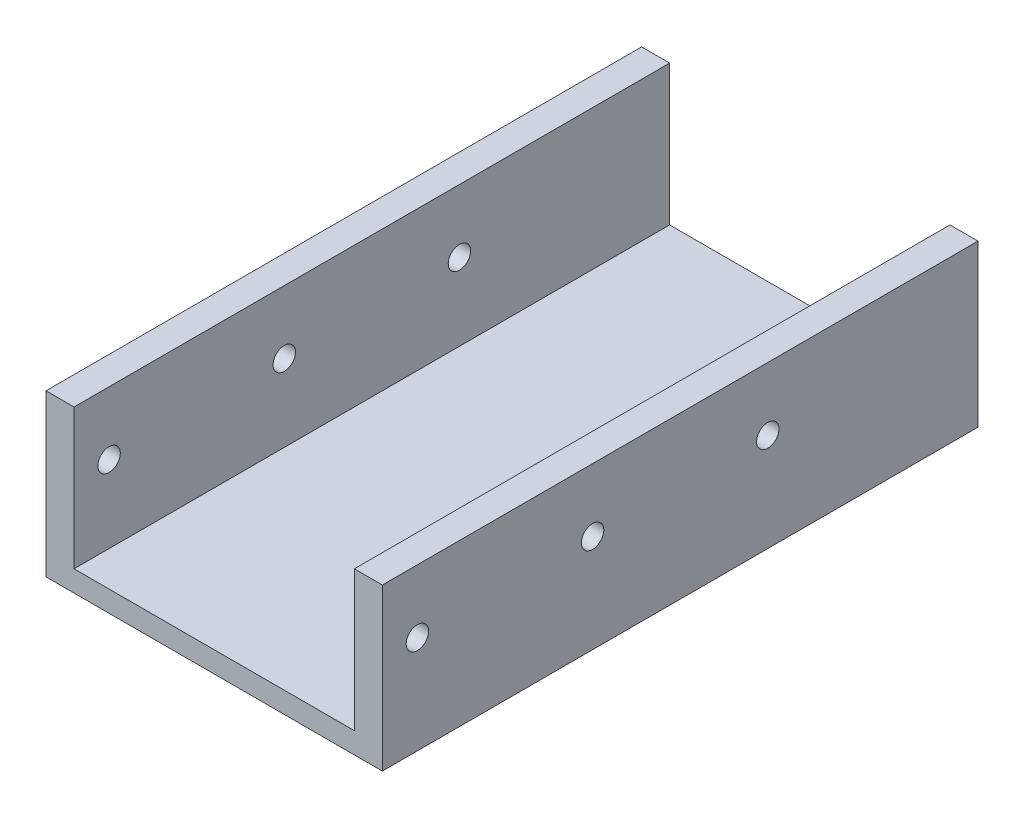
ISO-10303-21;
HEADER;
FILE_DESCRIPTION(('STEP AP214'),'2;1');
FILE_NAME('part.step','',(''),(''),'','','');
FILE_SCHEMA(('AUTOMOTIVE_DESIGN { 1 0 10303 214 1 1 1 1 }'));
ENDSEC;
DATA;
#1=APPLICATION_CONTEXT('core data for automotive mechanical design processes');
#2=APPLICATION_PROTOCOL_DEFINITION('international standard','automotive_design',2000,#1);
#3=PRODUCT_CONTEXT('',#1,'mechanical');
#4=PRODUCT('Part','Part','',(#3));
#5=PRODUCT_RELATED_PRODUCT_CATEGORY('part','',(#4));
#6=PRODUCT_DEFINITION_FORMATION('','',#4);
#7=PRODUCT_DEFINITION_CONTEXT('part definition',#1,'design');
#8=PRODUCT_DEFINITION('design','',#6,#7);
#9=PRODUCT_DEFINITION_SHAPE('','',#8);
#10=(LENGTH_UNIT() NAMED_UNIT(*) SI_UNIT(.MILLI.,.METRE.));
#11=(NAMED_UNIT(*) PLANE_ANGLE_UNIT() SI_UNIT($,.RADIAN.));
#12=(NAMED_UNIT(*) SI_UNIT($,.STERADIAN.) SOLID_ANGLE_UNIT());
#13=UNCERTAINTY_MEASURE_WITH_UNIT(LENGTH_MEASURE(1.E-05),#10,'distance_accuracy_value','');
#14=(GEOMETRIC_REPRESENTATION_CONTEXT(3) GLOBAL_UNCERTAINTY_ASSIGNED_CONTEXT((#13)) GLOBAL_UNIT_ASSIGNED_CONTEXT((#10,
#11,#12)) REPRESENTATION_CONTEXT('',''));
#15=CARTESIAN_POINT('',(0.,0.,0.));
#16=DIRECTION('',(0.,0.,1.));
#17=DIRECTION('',(1.,0.,0.));
#18=AXIS2_PLACEMENT_3D('',#15,#16,#17);
#19=CARTESIAN_POINT('',(0.,3.,0.));
#20=DIRECTION('',(0.,-1.,0.));
#21=DIRECTION('',(0.,0.,-1.));
#22=AXIS2_PLACEMENT_3D('',#19,#20,#21);
#23=PLANE('',#22);
#24=DIRECTION('',(0.,0.,-1.));
#25=VECTOR('',#24,1.);
#26=CARTESIAN_POINT('',(-20.,3.,-55.));
#27=LINE('',#26,#25);
#28=CARTESIAN_POINT('',(-20.,3.,30.));
#29=VERTEX_POINT('',#28);
#30=CARTESIAN_POINT('',(-20.,3.,-55.));
#31=VERTEX_POINT('',#30);
#32=EDGE_CURVE('E167',#29,#31,#27,.T.);
#33=ORIENTED_EDGE('',*,*,#32,.F.);
#34=DIRECTION('',(1.,0.,0.));
#35=VECTOR('',#34,1.);
#36=CARTESIAN_POINT('',(0.,3.,30.));
#37=LINE('',#36,#35);
#38=CARTESIAN_POINT('',(20.,3.,30.));
#39=VERTEX_POINT('',#38);
#40=EDGE_CURVE('E192',#29,#39,#37,.T.);
#41=ORIENTED_EDGE('',*,*,#40,.T.);
#42=DIRECTION('',(0.,0.,1.));
#43=VECTOR('',#42,1.);
#44=CARTESIAN_POINT('',(20.,3.,-55.));
#45=LINE('',#44,#43);
#46=CARTESIAN_POINT('',(20.,3.,-55.));
#47=VERTEX_POINT('',#46);
#48=EDGE_CURVE('E60',#47,#39,#45,.T.);
#49=ORIENTED_EDGE('',*,*,#48,.F.);
#50=DIRECTION('',(-1.,0.,0.));
#51=VECTOR('',#50,1.);
#52=CARTESIAN_POINT('',(-24.,3.,-55.));
#53=LINE('',#52,#51);
#54=EDGE_CURVE('E124',#47,#31,#53,.T.);
#55=ORIENTED_EDGE('',*,*,#54,.T.);
#56=EDGE_LOOP('',(#33,#41,#49,#55));
#57=FACE_BOUND('',#56,.T.);
#58=ADVANCED_FACE('F38',(#57),#23,.F.);
#59=CARTESIAN_POINT('',(24.,3.,55.));
#60=DIRECTION('',(-1.,0.,0.));
#61=DIRECTION('',(0.,0.,1.));
#62=AXIS2_PLACEMENT_3D('',#59,#60,#61);
#63=PLANE('',#62);
#64=CARTESIAN_POINT('',(24.,14.,25.));
#65=DIRECTION('',(-1.,0.,0.));
#66=DIRECTION('',(0.,0.,-1.));
#67=AXIS2_PLACEMENT_3D('',#64,#65,#66);
#68=CIRCLE('',#67,1.59999999999999);
#69=CARTESIAN_POINT('',(24.,14.,23.4));
#70=VERTEX_POINT('',#69);
#71=EDGE_CURVE('E208',#70,#70,#68,.T.);
#72=ORIENTED_EDGE('',*,*,#71,.T.);
#73=EDGE_LOOP('',(#72));
#74=FACE_BOUND('',#73,.T.);
#75=CARTESIAN_POINT('',(24.,14.,-25.));
#76=DIRECTION('',(-1.,0.,0.));
#77=DIRECTION('',(0.,0.,1.));
#78=AXIS2_PLACEMENT_3D('',#75,#76,#77);
#79=CIRCLE('',#78,1.6);
#80=CARTESIAN_POINT('',(24.,14.,-23.4));
#81=VERTEX_POINT('',#80);
#82=EDGE_CURVE('E201',#81,#81,#79,.T.);
#83=ORIENTED_EDGE('',*,*,#82,.T.);
#84=EDGE_LOOP('',(#83));
#85=FACE_BOUND('',#84,.T.);
#86=CARTESIAN_POINT('',(24.,14.,0.));
#87=DIRECTION('',(-1.,0.,0.));
#88=DIRECTION('',(0.,0.,1.));
#89=AXIS2_PLACEMENT_3D('',#86,#87,#88);
#90=CIRCLE('',#89,1.6);
#91=CARTESIAN_POINT('',(24.,14.,1.6));
#92=VERTEX_POINT('',#91);
#93=EDGE_CURVE('E138',#92,#92,#90,.T.);
#94=ORIENTED_EDGE('',*,*,#93,.T.);
#95=EDGE_LOOP('',(#94));
#96=FACE_BOUND('',#95,.T.);
#97=DIRECTION('',(0.,0.,-1.));
#98=VECTOR('',#97,1.);
#99=CARTESIAN_POINT('',(24.,23.,-55.));
#100=LINE('',#99,#98);
#101=CARTESIAN_POINT('',(24.,23.,30.));
#102=VERTEX_POINT('',#101);
#103=CARTESIAN_POINT('',(24.,23.,-55.));
#104=VERTEX_POINT('',#103);
#105=EDGE_CURVE('E156',#102,#104,#100,.T.);
#106=ORIENTED_EDGE('',*,*,#105,.F.);
#107=DIRECTION('',(0.,1.,0.));
#108=VECTOR('',#107,1.);
#109=CARTESIAN_POINT('',(24.,23.,30.));
#110=LINE('',#109,#108);
#111=CARTESIAN_POINT('',(24.,0.,30.));
#112=VERTEX_POINT('',#111);
#113=EDGE_CURVE('E53',#112,#102,#110,.T.);
#114=ORIENTED_EDGE('',*,*,#113,.F.);
#115=DIRECTION('',(0.,0.,-1.));
#116=VECTOR('',#115,1.);
#117=CARTESIAN_POINT('',(24.,0.,55.));
#118=LINE('',#117,#116);
#119=CARTESIAN_POINT('',(24.,0.,-55.));
#120=VERTEX_POINT('',#119);
#121=EDGE_CURVE('E119',#112,#120,#118,.T.);
#122=ORIENTED_EDGE('',*,*,#121,.T.);
#123=DIRECTION('',(0.,-1.,0.));
#124=VECTOR('',#123,1.);
#125=CARTESIAN_POINT('',(24.,3.,-55.));
#126=LINE('',#125,#124);
#127=EDGE_CURVE('E46',#104,#120,#126,.T.);
#128=ORIENTED_EDGE('',*,*,#127,.F.);
#129=EDGE_LOOP('',(#106,#114,#122,#128));
#130=FACE_BOUND('',#129,.T.);
#131=ADVANCED_FACE('F40',(#74,#85,#96,#130),#63,.F.);
#132=CARTESIAN_POINT('',(-24.,3.,-55.));
#133=DIRECTION('',(0.,0.,1.));
#134=DIRECTION('',(1.,0.,0.));
#135=AXIS2_PLACEMENT_3D('',#132,#133,#134);
#136=PLANE('',#135);
#137=DIRECTION('',(-1.,0.,0.));
#138=VECTOR('',#137,1.);
#139=CARTESIAN_POINT('',(-24.,0.,-55.));
#140=LINE('',#139,#138);
#141=CARTESIAN_POINT('',(-24.,0.,-55.));
#142=VERTEX_POINT('',#141);
#143=EDGE_CURVE('E125',#120,#142,#140,.T.);
#144=ORIENTED_EDGE('',*,*,#143,.T.);
#145=DIRECTION('',(0.,-1.,0.));
#146=VECTOR('',#145,1.);
#147=CARTESIAN_POINT('',(-24.,3.,-55.));
#148=LINE('',#147,#146);
#149=CARTESIAN_POINT('',(-24.,23.,-55.));
#150=VERTEX_POINT('',#149);
#151=EDGE_CURVE('E123',#150,#142,#148,.T.);
#152=ORIENTED_EDGE('',*,*,#151,.F.);
#153=DIRECTION('',(-1.,0.,0.));
#154=VECTOR('',#153,1.);
#155=CARTESIAN_POINT('',(-24.,23.,-55.));
#156=LINE('',#155,#154);
#157=CARTESIAN_POINT('',(-20.,23.,-55.));
#158=VERTEX_POINT('',#157);
#159=EDGE_CURVE('E172',#158,#150,#156,.T.);
#160=ORIENTED_EDGE('',*,*,#159,.F.);
#161=DIRECTION('',(0.,-1.,0.));
#162=VECTOR('',#161,1.);
#163=CARTESIAN_POINT('',(-20.,23.,-55.));
#164=LINE('',#163,#162);
#165=EDGE_CURVE('E175',#158,#31,#164,.T.);
#166=ORIENTED_EDGE('',*,*,#165,.T.);
#167=ORIENTED_EDGE('',*,*,#54,.F.);
#168=DIRECTION('',(0.,-1.,0.));
#169=VECTOR('',#168,1.);
#170=CARTESIAN_POINT('',(20.,23.,-55.));
#171=LINE('',#170,#169);
#172=CARTESIAN_POINT('',(20.,23.,-55.));
#173=VERTEX_POINT('',#172);
#174=EDGE_CURVE('E163',#173,#47,#171,.T.);
#175=ORIENTED_EDGE('',*,*,#174,.F.);
#176=DIRECTION('',(-1.,0.,0.));
#177=VECTOR('',#176,1.);
#178=CARTESIAN_POINT('',(24.,23.,-55.));
#179=LINE('',#178,#177);
#180=EDGE_CURVE('E158',#104,#173,#179,.T.);
#181=ORIENTED_EDGE('',*,*,#180,.F.);
#182=ORIENTED_EDGE('',*,*,#127,.T.);
#183=EDGE_LOOP('',(#144,#152,#160,#166,#167,#175,#181,#182));
#184=FACE_BOUND('',#183,.T.);
#185=ADVANCED_FACE('F183',(#184),#136,.F.);
#186=CARTESIAN_POINT('',(-24.,3.,55.));
#187=DIRECTION('',(1.,0.,0.));
#188=DIRECTION('',(0.,0.,-1.));
#189=AXIS2_PLACEMENT_3D('',#186,#187,#188);
#190=PLANE('',#189);
#191=CARTESIAN_POINT('',(-24.,14.,25.));
#192=DIRECTION('',(-1.,0.,0.));
#193=DIRECTION('',(0.,0.,-1.));
#194=AXIS2_PLACEMENT_3D('',#191,#192,#193);
#195=CIRCLE('',#194,1.59999999999999);
#196=CARTESIAN_POINT('',(-24.,14.,23.4));
#197=VERTEX_POINT('',#196);
#198=EDGE_CURVE('E200',#197,#197,#195,.T.);
#199=ORIENTED_EDGE('',*,*,#198,.F.);
#200=EDGE_LOOP('',(#199));
#201=FACE_BOUND('',#200,.T.);
#202=CARTESIAN_POINT('',(-24.,14.,-25.));
#203=DIRECTION('',(-1.,0.,0.));
#204=DIRECTION('',(0.,0.,1.));
#205=AXIS2_PLACEMENT_3D('',#202,#203,#204);
#206=CIRCLE('',#205,1.6);
#207=CARTESIAN_POINT('',(-24.,14.,-23.4));
#208=VERTEX_POINT('',#207);
#209=EDGE_CURVE('E205',#208,#208,#206,.T.);
#210=ORIENTED_EDGE('',*,*,#209,.F.);
#211=EDGE_LOOP('',(#210));
#212=FACE_BOUND('',#211,.T.);
#213=CARTESIAN_POINT('',(-24.,14.,0.));
#214=DIRECTION('',(-1.,0.,0.));
#215=DIRECTION('',(0.,0.,1.));
#216=AXIS2_PLACEMENT_3D('',#213,#214,#215);
#217=CIRCLE('',#216,1.6);
#218=CARTESIAN_POINT('',(-24.,14.,1.6));
#219=VERTEX_POINT('',#218);
#220=EDGE_CURVE('E204',#219,#219,#217,.T.);
#221=ORIENTED_EDGE('',*,*,#220,.F.);
#222=EDGE_LOOP('',(#221));
#223=FACE_BOUND('',#222,.T.);
#224=DIRECTION('',(0.,0.,1.));
#225=VECTOR('',#224,1.);
#226=CARTESIAN_POINT('',(-24.,0.,55.));
#227=LINE('',#226,#225);
#228=CARTESIAN_POINT('',(-24.,0.,30.));
#229=VERTEX_POINT('',#228);
#230=EDGE_CURVE('E118',#142,#229,#227,.T.);
#231=ORIENTED_EDGE('',*,*,#230,.T.);
#232=DIRECTION('',(0.,1.,0.));
#233=VECTOR('',#232,1.);
#234=CARTESIAN_POINT('',(-24.,23.,30.));
#235=LINE('',#234,#233);
#236=CARTESIAN_POINT('',(-24.,23.,30.));
#237=VERTEX_POINT('',#236);
#238=EDGE_CURVE('E102',#229,#237,#235,.T.);
#239=ORIENTED_EDGE('',*,*,#238,.T.);
#240=DIRECTION('',(0.,0.,1.));
#241=VECTOR('',#240,1.);
#242=CARTESIAN_POINT('',(-24.,23.,-55.));
#243=LINE('',#242,#241);
#244=EDGE_CURVE('E168',#150,#237,#243,.T.);
#245=ORIENTED_EDGE('',*,*,#244,.F.);
#246=ORIENTED_EDGE('',*,*,#151,.T.);
#247=EDGE_LOOP('',(#231,#239,#245,#246));
#248=FACE_BOUND('',#247,.T.);
#249=ADVANCED_FACE('F122',(#201,#212,#223,#248),#190,.F.);
#250=CARTESIAN_POINT('',(0.,0.,0.));
#251=DIRECTION('',(0.,-1.,0.));
#252=DIRECTION('',(0.,0.,-1.));
#253=AXIS2_PLACEMENT_3D('',#250,#251,#252);
#254=PLANE('',#253);
#255=DIRECTION('',(1.,0.,0.));
#256=VECTOR('',#255,1.);
#257=CARTESIAN_POINT('',(-24.,0.,30.));
#258=LINE('',#257,#256);
#259=EDGE_CURVE('E105',#229,#112,#258,.T.);
#260=ORIENTED_EDGE('',*,*,#259,.F.);
#261=ORIENTED_EDGE('',*,*,#230,.F.);
#262=ORIENTED_EDGE('',*,*,#143,.F.);
#263=ORIENTED_EDGE('',*,*,#121,.F.);
#264=EDGE_LOOP('',(#260,#261,#262,#263));
#265=FACE_BOUND('',#264,.T.);
#266=ADVANCED_FACE('F116',(#265),#254,.T.);
#267=CARTESIAN_POINT('',(-20.,23.,-55.));
#268=DIRECTION('',(-1.,0.,0.));
#269=DIRECTION('',(0.,0.,1.));
#270=AXIS2_PLACEMENT_3D('',#267,#268,#269);
#271=PLANE('',#270);
#272=CARTESIAN_POINT('',(-20.,14.,25.));
#273=DIRECTION('',(-1.,0.,0.));
#274=DIRECTION('',(0.,0.,1.));
#275=AXIS2_PLACEMENT_3D('',#272,#273,#274);
#276=CIRCLE('',#275,1.59999999999999);
#277=CARTESIAN_POINT('',(-20.,14.,26.6));
#278=VERTEX_POINT('',#277);
#279=EDGE_CURVE('E144',#278,#278,#276,.T.);
#280=ORIENTED_EDGE('',*,*,#279,.T.);
#281=EDGE_LOOP('',(#280));
#282=FACE_BOUND('',#281,.T.);
#283=CARTESIAN_POINT('',(-20.,14.,-25.));
#284=DIRECTION('',(-1.,0.,0.));
#285=DIRECTION('',(0.,0.,1.));
#286=AXIS2_PLACEMENT_3D('',#283,#284,#285);
#287=CIRCLE('',#286,1.6);
#288=CARTESIAN_POINT('',(-20.,14.,-23.4));
#289=VERTEX_POINT('',#288);
#290=EDGE_CURVE('E141',#289,#289,#287,.T.);
#291=ORIENTED_EDGE('',*,*,#290,.T.);
#292=EDGE_LOOP('',(#291));
#293=FACE_BOUND('',#292,.T.);
#294=CARTESIAN_POINT('',(-20.,14.,0.));
#295=DIRECTION('',(-1.,0.,0.));
#296=DIRECTION('',(0.,0.,1.));
#297=AXIS2_PLACEMENT_3D('',#294,#295,#296);
#298=CIRCLE('',#297,1.6);
#299=CARTESIAN_POINT('',(-20.,14.,1.6));
#300=VERTEX_POINT('',#299);
#301=EDGE_CURVE('E137',#300,#300,#298,.T.);
#302=ORIENTED_EDGE('',*,*,#301,.T.);
#303=EDGE_LOOP('',(#302));
#304=FACE_BOUND('',#303,.T.);
#305=DIRECTION('',(0.,0.,-1.));
#306=VECTOR('',#305,1.);
#307=CARTESIAN_POINT('',(-20.,23.,-55.));
#308=LINE('',#307,#306);
#309=CARTESIAN_POINT('',(-20.,23.,30.));
#310=VERTEX_POINT('',#309);
#311=EDGE_CURVE('E170',#310,#158,#308,.T.);
#312=ORIENTED_EDGE('',*,*,#311,.F.);
#313=DIRECTION('',(0.,-1.,0.));
#314=VECTOR('',#313,1.);
#315=CARTESIAN_POINT('',(-20.,23.,30.));
#316=LINE('',#315,#314);
#317=EDGE_CURVE('E194',#310,#29,#316,.T.);
#318=ORIENTED_EDGE('',*,*,#317,.T.);
#319=ORIENTED_EDGE('',*,*,#32,.T.);
#320=ORIENTED_EDGE('',*,*,#165,.F.);
#321=EDGE_LOOP('',(#312,#318,#319,#320));
#322=FACE_BOUND('',#321,.T.);
#323=ADVANCED_FACE('F227',(#282,#293,#304,#322),#271,.F.);
#324=CARTESIAN_POINT('',(0.,23.,0.));
#325=DIRECTION('',(0.,1.,0.));
#326=DIRECTION('',(0.,0.,1.));
#327=AXIS2_PLACEMENT_3D('',#324,#325,#326);
#328=PLANE('',#327);
#329=DIRECTION('',(1.,0.,0.));
#330=VECTOR('',#329,1.);
#331=CARTESIAN_POINT('',(-24.,23.,30.));
#332=LINE('',#331,#330);
#333=EDGE_CURVE('E107',#237,#310,#332,.T.);
#334=ORIENTED_EDGE('',*,*,#333,.T.);
#335=ORIENTED_EDGE('',*,*,#311,.T.);
#336=ORIENTED_EDGE('',*,*,#159,.T.);
#337=ORIENTED_EDGE('',*,*,#244,.T.);
#338=EDGE_LOOP('',(#334,#335,#336,#337));
#339=FACE_BOUND('',#338,.T.);
#340=ADVANCED_FACE('F241',(#339),#328,.T.);
#341=CARTESIAN_POINT('',(20.,23.,-55.));
#342=DIRECTION('',(1.,0.,0.));
#343=DIRECTION('',(0.,0.,-1.));
#344=AXIS2_PLACEMENT_3D('',#341,#342,#343);
#345=PLANE('',#344);
#346=CARTESIAN_POINT('',(20.,14.,25.));
#347=DIRECTION('',(1.,0.,0.));
#348=DIRECTION('',(0.,0.,-1.));
#349=AXIS2_PLACEMENT_3D('',#346,#347,#348);
#350=CIRCLE('',#349,1.59999999999999);
#351=CARTESIAN_POINT('',(20.,14.,23.4));
#352=VERTEX_POINT('',#351);
#353=EDGE_CURVE('E142',#352,#352,#350,.T.);
#354=ORIENTED_EDGE('',*,*,#353,.T.);
#355=EDGE_LOOP('',(#354));
#356=FACE_BOUND('',#355,.T.);
#357=CARTESIAN_POINT('',(20.,14.,-25.));
#358=DIRECTION('',(1.,0.,0.));
#359=DIRECTION('',(0.,0.,-1.));
#360=AXIS2_PLACEMENT_3D('',#357,#358,#359);
#361=CIRCLE('',#360,1.6);
#362=CARTESIAN_POINT('',(20.,14.,-26.6));
#363=VERTEX_POINT('',#362);
#364=EDGE_CURVE('E139',#363,#363,#361,.T.);
#365=ORIENTED_EDGE('',*,*,#364,.T.);
#366=EDGE_LOOP('',(#365));
#367=FACE_BOUND('',#366,.T.);
#368=CARTESIAN_POINT('',(20.,14.,0.));
#369=DIRECTION('',(1.,0.,0.));
#370=DIRECTION('',(0.,0.,-1.));
#371=AXIS2_PLACEMENT_3D('',#368,#369,#370);
#372=CIRCLE('',#371,1.6);
#373=CARTESIAN_POINT('',(20.,14.,-1.6));
#374=VERTEX_POINT('',#373);
#375=EDGE_CURVE('E134',#374,#374,#372,.T.);
#376=ORIENTED_EDGE('',*,*,#375,.T.);
#377=EDGE_LOOP('',(#376));
#378=FACE_BOUND('',#377,.T.);
#379=ORIENTED_EDGE('',*,*,#48,.T.);
#380=DIRECTION('',(0.,1.,0.));
#381=VECTOR('',#380,1.);
#382=CARTESIAN_POINT('',(20.,23.,30.));
#383=LINE('',#382,#381);
#384=CARTESIAN_POINT('',(20.,23.,30.));
#385=VERTEX_POINT('',#384);
#386=EDGE_CURVE('E189',#39,#385,#383,.T.);
#387=ORIENTED_EDGE('',*,*,#386,.T.);
#388=DIRECTION('',(0.,0.,1.));
#389=VECTOR('',#388,1.);
#390=CARTESIAN_POINT('',(20.,23.,-55.));
#391=LINE('',#390,#389);
#392=EDGE_CURVE('E160',#173,#385,#391,.T.);
#393=ORIENTED_EDGE('',*,*,#392,.F.);
#394=ORIENTED_EDGE('',*,*,#174,.T.);
#395=EDGE_LOOP('',(#379,#387,#393,#394));
#396=FACE_BOUND('',#395,.T.);
#397=ADVANCED_FACE('F191',(#356,#367,#378,#396),#345,.F.);
#398=CARTESIAN_POINT('',(0.,23.,0.));
#399=DIRECTION('',(0.,-1.,0.));
#400=DIRECTION('',(0.,0.,-1.));
#401=AXIS2_PLACEMENT_3D('',#398,#399,#400);
#402=PLANE('',#401);
#403=ORIENTED_EDGE('',*,*,#392,.T.);
#404=DIRECTION('',(1.,0.,0.));
#405=VECTOR('',#404,1.);
#406=CARTESIAN_POINT('',(0.,23.,30.));
#407=LINE('',#406,#405);
#408=EDGE_CURVE('E11',#385,#102,#407,.T.);
#409=ORIENTED_EDGE('',*,*,#408,.T.);
#410=ORIENTED_EDGE('',*,*,#105,.T.);
#411=ORIENTED_EDGE('',*,*,#180,.T.);
#412=EDGE_LOOP('',(#403,#409,#410,#411));
#413=FACE_BOUND('',#412,.T.);
#414=ADVANCED_FACE('F187',(#413),#402,.F.);
#415=CARTESIAN_POINT('',(24.,14.,0.));
#416=DIRECTION('',(-1.,0.,0.));
#417=DIRECTION('',(0.,0.,1.));
#418=AXIS2_PLACEMENT_3D('',#415,#416,#417);
#419=CYLINDRICAL_SURFACE('',#418,1.6);
#420=ORIENTED_EDGE('',*,*,#93,.F.);
#421=EDGE_LOOP('',(#420));
#422=FACE_BOUND('',#421,.T.);
#423=ORIENTED_EDGE('',*,*,#375,.F.);
#424=EDGE_LOOP('',(#423));
#425=FACE_BOUND('',#424,.T.);
#426=ADVANCED_FACE('F250',(#422,#425),#419,.F.);
#427=CARTESIAN_POINT('',(24.,14.,-25.));
#428=DIRECTION('',(-1.,0.,0.));
#429=DIRECTION('',(0.,0.,1.));
#430=AXIS2_PLACEMENT_3D('',#427,#428,#429);
#431=CYLINDRICAL_SURFACE('',#430,1.6);
#432=ORIENTED_EDGE('',*,*,#82,.F.);
#433=EDGE_LOOP('',(#432));
#434=FACE_BOUND('',#433,.T.);
#435=ORIENTED_EDGE('',*,*,#364,.F.);
#436=EDGE_LOOP('',(#435));
#437=FACE_BOUND('',#436,.T.);
#438=ADVANCED_FACE('F262',(#434,#437),#431,.F.);
#439=CARTESIAN_POINT('',(24.,14.,25.));
#440=DIRECTION('',(-1.,0.,0.));
#441=DIRECTION('',(0.,0.,1.));
#442=AXIS2_PLACEMENT_3D('',#439,#440,#441);
#443=CYLINDRICAL_SURFACE('',#442,1.59999999999999);
#444=ORIENTED_EDGE('',*,*,#71,.F.);
#445=EDGE_LOOP('',(#444));
#446=FACE_BOUND('',#445,.T.);
#447=ORIENTED_EDGE('',*,*,#353,.F.);
#448=EDGE_LOOP('',(#447));
#449=FACE_BOUND('',#448,.T.);
#450=ADVANCED_FACE('F254',(#446,#449),#443,.F.);
#451=ORIENTED_EDGE('',*,*,#220,.T.);
#452=EDGE_LOOP('',(#451));
#453=FACE_BOUND('',#452,.T.);
#454=ORIENTED_EDGE('',*,*,#301,.F.);
#455=EDGE_LOOP('',(#454));
#456=FACE_BOUND('',#455,.T.);
#457=ADVANCED_FACE('F217',(#453,#456),#419,.F.);
#458=ORIENTED_EDGE('',*,*,#209,.T.);
#459=EDGE_LOOP('',(#458));
#460=FACE_BOUND('',#459,.T.);
#461=ORIENTED_EDGE('',*,*,#290,.F.);
#462=EDGE_LOOP('',(#461));
#463=FACE_BOUND('',#462,.T.);
#464=ADVANCED_FACE('F253',(#460,#463),#431,.F.);
#465=ORIENTED_EDGE('',*,*,#198,.T.);
#466=EDGE_LOOP('',(#465));
#467=FACE_BOUND('',#466,.T.);
#468=ORIENTED_EDGE('',*,*,#279,.F.);
#469=EDGE_LOOP('',(#468));
#470=FACE_BOUND('',#469,.T.);
#471=ADVANCED_FACE('F255',(#467,#470),#443,.F.);
#472=CARTESIAN_POINT('',(-24.,23.,30.));
#473=DIRECTION('',(0.,0.,-1.));
#474=DIRECTION('',(0.,1.,0.));
#475=AXIS2_PLACEMENT_3D('',#472,#473,#474);
#476=PLANE('',#475);
#477=ORIENTED_EDGE('',*,*,#333,.F.);
#478=ORIENTED_EDGE('',*,*,#238,.F.);
#479=ORIENTED_EDGE('',*,*,#259,.T.);
#480=ORIENTED_EDGE('',*,*,#113,.T.);
#481=ORIENTED_EDGE('',*,*,#408,.F.);
#482=ORIENTED_EDGE('',*,*,#386,.F.);
#483=ORIENTED_EDGE('',*,*,#40,.F.);
#484=ORIENTED_EDGE('',*,*,#317,.F.);
#485=EDGE_LOOP('',(#477,#478,#479,#480,#481,#482,#483,#484));
#486=FACE_BOUND('',#485,.T.);
#487=ADVANCED_FACE('F104',(#486),#476,.F.);
#488=CLOSED_SHELL('',(#58,#131,#185,#249,#266,#323,#340,#397,#414,#426,#438,#450,#457,#464,#471,#487));
#489=MANIFOLD_SOLID_BREP('B2',#488);
#490=ADVANCED_BREP_SHAPE_REPRESENTATION('',(#18,#489),#14);
#491=SHAPE_DEFINITION_REPRESENTATION(#9,#490);
ENDSEC;
END-ISO-10303-21;
